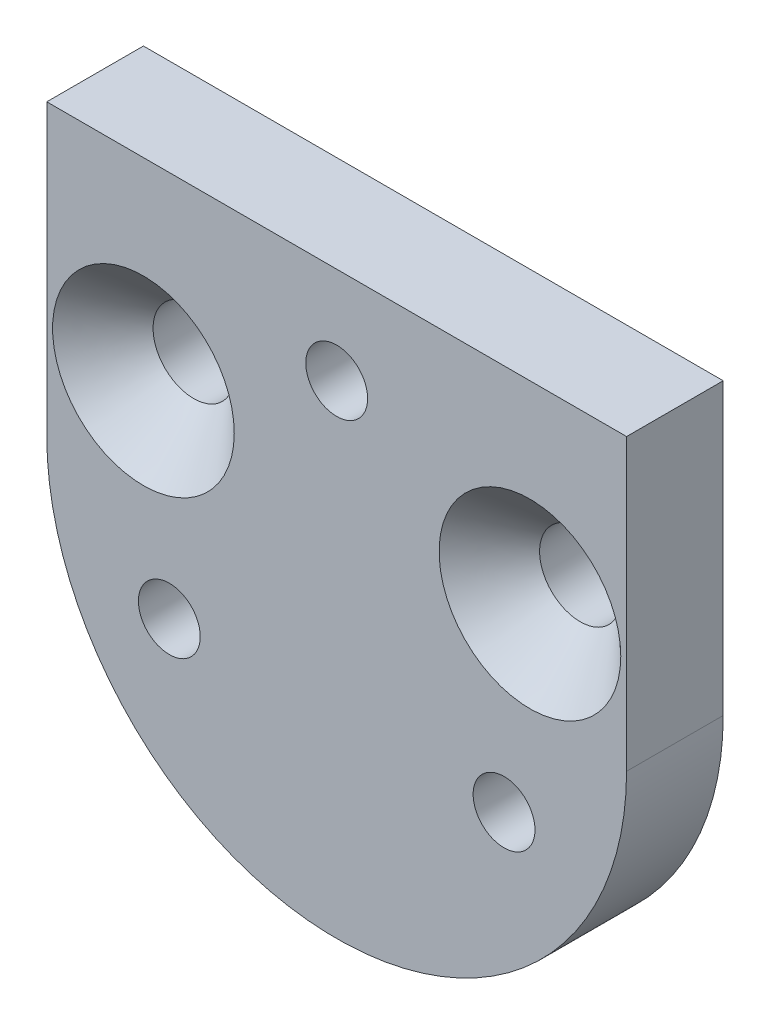
ISO-10303-21;
HEADER;
FILE_DESCRIPTION(('STEP AP214'),'2;1');
FILE_NAME('part.step','',(''),(''),'','','');
FILE_SCHEMA(('AUTOMOTIVE_DESIGN { 1 0 10303 214 1 1 1 1 }'));
ENDSEC;
DATA;
#1=APPLICATION_CONTEXT('core data for automotive mechanical design processes');
#2=APPLICATION_PROTOCOL_DEFINITION('international standard','automotive_design',2000,#1);
#3=PRODUCT_CONTEXT('',#1,'mechanical');
#4=PRODUCT('Part','Part','',(#3));
#5=PRODUCT_RELATED_PRODUCT_CATEGORY('part','',(#4));
#6=PRODUCT_DEFINITION_FORMATION('','',#4);
#7=PRODUCT_DEFINITION_CONTEXT('part definition',#1,'design');
#8=PRODUCT_DEFINITION('design','',#6,#7);
#9=PRODUCT_DEFINITION_SHAPE('','',#8);
#10=(LENGTH_UNIT() NAMED_UNIT(*) SI_UNIT(.MILLI.,.METRE.));
#11=(NAMED_UNIT(*) PLANE_ANGLE_UNIT() SI_UNIT($,.RADIAN.));
#12=(NAMED_UNIT(*) SI_UNIT($,.STERADIAN.) SOLID_ANGLE_UNIT());
#13=UNCERTAINTY_MEASURE_WITH_UNIT(LENGTH_MEASURE(1.E-05),#10,'distance_accuracy_value','');
#14=(GEOMETRIC_REPRESENTATION_CONTEXT(3) GLOBAL_UNCERTAINTY_ASSIGNED_CONTEXT((#13)) GLOBAL_UNIT_ASSIGNED_CONTEXT((#10,
#11,#12)) REPRESENTATION_CONTEXT('',''));
#15=CARTESIAN_POINT('',(0.,0.,0.));
#16=DIRECTION('',(0.,0.,1.));
#17=DIRECTION('',(1.,0.,0.));
#18=AXIS2_PLACEMENT_3D('',#15,#16,#17);
#19=CARTESIAN_POINT('',(-8.66025403784439,-5.,0.));
#20=DIRECTION('',(0.,0.,1.));
#21=DIRECTION('',(1.,0.,0.));
#22=AXIS2_PLACEMENT_3D('',#19,#20,#21);
#23=CYLINDRICAL_SURFACE('',#22,1.6);
#24=CARTESIAN_POINT('',(-8.66025403784439,-5.,5.));
#25=DIRECTION('',(0.,0.,1.));
#26=DIRECTION('',(1.,0.,0.));
#27=AXIS2_PLACEMENT_3D('',#24,#25,#26);
#28=CIRCLE('',#27,1.6);
#29=CARTESIAN_POINT('',(-7.06025403784438,-5.,5.));
#30=VERTEX_POINT('',#29);
#31=EDGE_CURVE('E356',#30,#30,#28,.T.);
#32=ORIENTED_EDGE('',*,*,#31,.T.);
#33=EDGE_LOOP('',(#32));
#34=FACE_BOUND('',#33,.T.);
#35=CARTESIAN_POINT('',(-8.66025403784439,-5.,2.6));
#36=DIRECTION('',(0.,0.,-1.));
#37=DIRECTION('',(-1.,0.,0.));
#38=AXIS2_PLACEMENT_3D('',#35,#36,#37);
#39=CIRCLE('',#38,1.6);
#40=CARTESIAN_POINT('',(-10.2602540378444,-5.,2.6));
#41=VERTEX_POINT('',#40);
#42=EDGE_CURVE('E38',#41,#41,#39,.F.);
#43=ORIENTED_EDGE('',*,*,#42,.F.);
#44=EDGE_LOOP('',(#43));
#45=FACE_BOUND('',#44,.T.);
#46=ADVANCED_FACE('F34',(#34,#45),#23,.F.);
#47=CARTESIAN_POINT('',(8.66025403784439,-5.,0.));
#48=DIRECTION('',(0.,0.,1.));
#49=DIRECTION('',(1.,0.,0.));
#50=AXIS2_PLACEMENT_3D('',#47,#48,#49);
#51=CYLINDRICAL_SURFACE('',#50,1.6);
#52=CARTESIAN_POINT('',(8.66025403784439,-5.,5.));
#53=DIRECTION('',(0.,0.,1.));
#54=DIRECTION('',(1.,0.,0.));
#55=AXIS2_PLACEMENT_3D('',#52,#53,#54);
#56=CIRCLE('',#55,1.6);
#57=CARTESIAN_POINT('',(10.2602540378444,-5.,5.));
#58=VERTEX_POINT('',#57);
#59=EDGE_CURVE('E353',#58,#58,#56,.T.);
#60=ORIENTED_EDGE('',*,*,#59,.T.);
#61=EDGE_LOOP('',(#60));
#62=FACE_BOUND('',#61,.T.);
#63=CARTESIAN_POINT('',(8.66025403784439,-5.,2.6));
#64=DIRECTION('',(0.,0.,-1.));
#65=DIRECTION('',(-1.,0.,0.));
#66=AXIS2_PLACEMENT_3D('',#63,#64,#65);
#67=CIRCLE('',#66,1.6);
#68=CARTESIAN_POINT('',(7.06025403784439,-5.,2.6));
#69=VERTEX_POINT('',#68);
#70=EDGE_CURVE('E389',#69,#69,#67,.F.);
#71=ORIENTED_EDGE('',*,*,#70,.F.);
#72=EDGE_LOOP('',(#71));
#73=FACE_BOUND('',#72,.T.);
#74=ADVANCED_FACE('F399',(#62,#73),#51,.F.);
#75=CARTESIAN_POINT('',(0.,10.,0.));
#76=DIRECTION('',(0.,0.,1.));
#77=DIRECTION('',(1.,0.,0.));
#78=AXIS2_PLACEMENT_3D('',#75,#76,#77);
#79=CYLINDRICAL_SURFACE('',#78,1.6);
#80=CARTESIAN_POINT('',(0.,10.,5.));
#81=DIRECTION('',(0.,0.,1.));
#82=DIRECTION('',(1.,0.,0.));
#83=AXIS2_PLACEMENT_3D('',#80,#81,#82);
#84=CIRCLE('',#83,1.6);
#85=CARTESIAN_POINT('',(1.6,10.,5.));
#86=VERTEX_POINT('',#85);
#87=EDGE_CURVE('E349',#86,#86,#84,.T.);
#88=ORIENTED_EDGE('',*,*,#87,.T.);
#89=EDGE_LOOP('',(#88));
#90=FACE_BOUND('',#89,.T.);
#91=CARTESIAN_POINT('',(0.,10.,2.6));
#92=DIRECTION('',(0.,0.,-1.));
#93=DIRECTION('',(-1.,0.,0.));
#94=AXIS2_PLACEMENT_3D('',#91,#92,#93);
#95=CIRCLE('',#94,1.6);
#96=CARTESIAN_POINT('',(-1.6,10.,2.6));
#97=VERTEX_POINT('',#96);
#98=EDGE_CURVE('E234',#97,#97,#95,.F.);
#99=ORIENTED_EDGE('',*,*,#98,.F.);
#100=EDGE_LOOP('',(#99));
#101=FACE_BOUND('',#100,.T.);
#102=ADVANCED_FACE('F405',(#90,#101),#79,.F.);
#103=CARTESIAN_POINT('',(-15.,15.,5.));
#104=DIRECTION('',(1.,0.,0.));
#105=DIRECTION('',(0.,1.,0.));
#106=AXIS2_PLACEMENT_3D('',#103,#104,#105);
#107=PLANE('',#106);
#108=DIRECTION('',(0.,-1.,0.));
#109=VECTOR('',#108,1.);
#110=CARTESIAN_POINT('',(-15.,15.,0.));
#111=LINE('',#110,#109);
#112=CARTESIAN_POINT('',(-15.,15.,0.));
#113=VERTEX_POINT('',#112);
#114=CARTESIAN_POINT('',(-15.,0.,0.));
#115=VERTEX_POINT('',#114);
#116=EDGE_CURVE('E352',#113,#115,#111,.T.);
#117=ORIENTED_EDGE('',*,*,#116,.T.);
#118=DIRECTION('',(0.,0.,-1.));
#119=VECTOR('',#118,1.);
#120=CARTESIAN_POINT('',(-15.,0.,5.));
#121=LINE('',#120,#119);
#122=CARTESIAN_POINT('',(-15.,0.,5.));
#123=VERTEX_POINT('',#122);
#124=EDGE_CURVE('E11',#123,#115,#121,.T.);
#125=ORIENTED_EDGE('',*,*,#124,.F.);
#126=DIRECTION('',(0.,-1.,0.));
#127=VECTOR('',#126,1.);
#128=CARTESIAN_POINT('',(-15.,15.,5.));
#129=LINE('',#128,#127);
#130=CARTESIAN_POINT('',(-15.,15.,5.));
#131=VERTEX_POINT('',#130);
#132=EDGE_CURVE('E359',#131,#123,#129,.T.);
#133=ORIENTED_EDGE('',*,*,#132,.F.);
#134=DIRECTION('',(0.,0.,-1.));
#135=VECTOR('',#134,1.);
#136=CARTESIAN_POINT('',(-15.,15.,5.));
#137=LINE('',#136,#135);
#138=EDGE_CURVE('E369',#131,#113,#137,.T.);
#139=ORIENTED_EDGE('',*,*,#138,.T.);
#140=EDGE_LOOP('',(#117,#125,#133,#139));
#141=FACE_BOUND('',#140,.T.);
#142=ADVANCED_FACE('F36',(#141),#107,.F.);
#143=CARTESIAN_POINT('',(0.,0.,5.));
#144=DIRECTION('',(0.,0.,-1.));
#145=DIRECTION('',(-1.,0.,0.));
#146=AXIS2_PLACEMENT_3D('',#143,#144,#145);
#147=CYLINDRICAL_SURFACE('',#146,15.);
#148=CARTESIAN_POINT('',(0.,0.,0.));
#149=DIRECTION('',(0.,0.,1.));
#150=DIRECTION('',(1.,0.,0.));
#151=AXIS2_PLACEMENT_3D('',#148,#149,#150);
#152=CIRCLE('',#151,15.);
#153=CARTESIAN_POINT('',(15.,0.,0.));
#154=VERTEX_POINT('',#153);
#155=EDGE_CURVE('E372',#115,#154,#152,.T.);
#156=ORIENTED_EDGE('',*,*,#155,.T.);
#157=DIRECTION('',(0.,0.,-1.));
#158=VECTOR('',#157,1.);
#159=CARTESIAN_POINT('',(15.,0.,5.));
#160=LINE('',#159,#158);
#161=CARTESIAN_POINT('',(15.,0.,5.));
#162=VERTEX_POINT('',#161);
#163=EDGE_CURVE('E43',#162,#154,#160,.T.);
#164=ORIENTED_EDGE('',*,*,#163,.F.);
#165=CARTESIAN_POINT('',(0.,0.,5.));
#166=DIRECTION('',(0.,0.,1.));
#167=DIRECTION('',(1.,0.,0.));
#168=AXIS2_PLACEMENT_3D('',#165,#166,#167);
#169=CIRCLE('',#168,15.);
#170=EDGE_CURVE('E362',#123,#162,#169,.T.);
#171=ORIENTED_EDGE('',*,*,#170,.F.);
#172=ORIENTED_EDGE('',*,*,#124,.T.);
#173=EDGE_LOOP('',(#156,#164,#171,#172));
#174=FACE_BOUND('',#173,.T.);
#175=ADVANCED_FACE('F425',(#174),#147,.T.);
#176=CARTESIAN_POINT('',(15.,15.,5.));
#177=DIRECTION('',(-1.,0.,0.));
#178=DIRECTION('',(0.,-1.,0.));
#179=AXIS2_PLACEMENT_3D('',#176,#177,#178);
#180=PLANE('',#179);
#181=DIRECTION('',(0.,1.,0.));
#182=VECTOR('',#181,1.);
#183=CARTESIAN_POINT('',(15.,15.,0.));
#184=LINE('',#183,#182);
#185=CARTESIAN_POINT('',(15.,15.,0.));
#186=VERTEX_POINT('',#185);
#187=EDGE_CURVE('E374',#154,#186,#184,.T.);
#188=ORIENTED_EDGE('',*,*,#187,.T.);
#189=DIRECTION('',(0.,0.,-1.));
#190=VECTOR('',#189,1.);
#191=CARTESIAN_POINT('',(15.,15.,5.));
#192=LINE('',#191,#190);
#193=CARTESIAN_POINT('',(15.,15.,5.));
#194=VERTEX_POINT('',#193);
#195=EDGE_CURVE('E379',#194,#186,#192,.T.);
#196=ORIENTED_EDGE('',*,*,#195,.F.);
#197=DIRECTION('',(0.,1.,0.));
#198=VECTOR('',#197,1.);
#199=CARTESIAN_POINT('',(15.,15.,5.));
#200=LINE('',#199,#198);
#201=EDGE_CURVE('E365',#162,#194,#200,.T.);
#202=ORIENTED_EDGE('',*,*,#201,.F.);
#203=ORIENTED_EDGE('',*,*,#163,.T.);
#204=EDGE_LOOP('',(#188,#196,#202,#203));
#205=FACE_BOUND('',#204,.T.);
#206=ADVANCED_FACE('F422',(#205),#180,.F.);
#207=CARTESIAN_POINT('',(-15.,15.,5.));
#208=DIRECTION('',(0.,-1.,0.));
#209=DIRECTION('',(0.,0.,-1.));
#210=AXIS2_PLACEMENT_3D('',#207,#208,#209);
#211=PLANE('',#210);
#212=DIRECTION('',(-1.,0.,0.));
#213=VECTOR('',#212,1.);
#214=CARTESIAN_POINT('',(-15.,15.,0.));
#215=LINE('',#214,#213);
#216=EDGE_CURVE('E363',#186,#113,#215,.T.);
#217=ORIENTED_EDGE('',*,*,#216,.T.);
#218=ORIENTED_EDGE('',*,*,#138,.F.);
#219=DIRECTION('',(-1.,0.,0.));
#220=VECTOR('',#219,1.);
#221=CARTESIAN_POINT('',(-15.,15.,5.));
#222=LINE('',#221,#220);
#223=EDGE_CURVE('E367',#194,#131,#222,.T.);
#224=ORIENTED_EDGE('',*,*,#223,.F.);
#225=ORIENTED_EDGE('',*,*,#195,.T.);
#226=EDGE_LOOP('',(#217,#218,#224,#225));
#227=FACE_BOUND('',#226,.T.);
#228=ADVANCED_FACE('F414',(#227),#211,.F.);
#229=CARTESIAN_POINT('',(0.,0.,5.));
#230=DIRECTION('',(0.,0.,1.));
#231=DIRECTION('',(1.,0.,0.));
#232=AXIS2_PLACEMENT_3D('',#229,#230,#231);
#233=PLANE('',#232);
#234=CARTESIAN_POINT('',(-10.,5.,5.));
#235=DIRECTION('',(0.,0.,1.));
#236=DIRECTION('',(1.,0.,0.));
#237=AXIS2_PLACEMENT_3D('',#234,#235,#236);
#238=CIRCLE('',#237,4.7);
#239=CARTESIAN_POINT('',(-5.3,5.,5.));
#240=VERTEX_POINT('',#239);
#241=EDGE_CURVE('E335',#240,#240,#238,.T.);
#242=ORIENTED_EDGE('',*,*,#241,.F.);
#243=EDGE_LOOP('',(#242));
#244=FACE_BOUND('',#243,.T.);
#245=CARTESIAN_POINT('',(10.,5.,5.));
#246=DIRECTION('',(0.,0.,1.));
#247=DIRECTION('',(1.,0.,0.));
#248=AXIS2_PLACEMENT_3D('',#245,#246,#247);
#249=CIRCLE('',#248,4.7);
#250=CARTESIAN_POINT('',(14.7,5.,5.));
#251=VERTEX_POINT('',#250);
#252=EDGE_CURVE('E342',#251,#251,#249,.T.);
#253=ORIENTED_EDGE('',*,*,#252,.F.);
#254=EDGE_LOOP('',(#253));
#255=FACE_BOUND('',#254,.T.);
#256=ORIENTED_EDGE('',*,*,#87,.F.);
#257=EDGE_LOOP('',(#256));
#258=FACE_BOUND('',#257,.T.);
#259=ORIENTED_EDGE('',*,*,#59,.F.);
#260=EDGE_LOOP('',(#259));
#261=FACE_BOUND('',#260,.T.);
#262=ORIENTED_EDGE('',*,*,#31,.F.);
#263=EDGE_LOOP('',(#262));
#264=FACE_BOUND('',#263,.T.);
#265=ORIENTED_EDGE('',*,*,#132,.T.);
#266=ORIENTED_EDGE('',*,*,#170,.T.);
#267=ORIENTED_EDGE('',*,*,#201,.T.);
#268=ORIENTED_EDGE('',*,*,#223,.T.);
#269=EDGE_LOOP('',(#265,#266,#267,#268));
#270=FACE_BOUND('',#269,.T.);
#271=ADVANCED_FACE('F410',(#244,#255,#258,#261,#264,#270),#233,.T.);
#272=CARTESIAN_POINT('',(0.,0.,0.));
#273=DIRECTION('',(0.,0.,1.));
#274=DIRECTION('',(1.,0.,0.));
#275=AXIS2_PLACEMENT_3D('',#272,#273,#274);
#276=PLANE('',#275);
#277=DIRECTION('',(0.5,0.866025403784438,0.));
#278=VECTOR('',#277,1.);
#279=CARTESIAN_POINT('',(-3.2331615074619,10.,0.));
#280=LINE('',#279,#278);
#281=CARTESIAN_POINT('',(-3.2331615074619,10.,0.));
#282=VERTEX_POINT('',#281);
#283=CARTESIAN_POINT('',(-1.61658075373095,12.8,0.));
#284=VERTEX_POINT('',#283);
#285=EDGE_CURVE('E221',#282,#284,#280,.T.);
#286=ORIENTED_EDGE('',*,*,#285,.F.);
#287=DIRECTION('',(-0.5,0.866025403784439,0.));
#288=VECTOR('',#287,1.);
#289=CARTESIAN_POINT('',(-1.61658075373095,7.2,0.));
#290=LINE('',#289,#288);
#291=CARTESIAN_POINT('',(-1.61658075373095,7.2,0.));
#292=VERTEX_POINT('',#291);
#293=EDGE_CURVE('E51',#292,#282,#290,.T.);
#294=ORIENTED_EDGE('',*,*,#293,.F.);
#295=DIRECTION('',(-1.,0.,0.));
#296=VECTOR('',#295,1.);
#297=CARTESIAN_POINT('',(1.61658075373095,7.2,0.));
#298=LINE('',#297,#296);
#299=CARTESIAN_POINT('',(1.61658075373095,7.2,0.));
#300=VERTEX_POINT('',#299);
#301=EDGE_CURVE('E207',#300,#292,#298,.T.);
#302=ORIENTED_EDGE('',*,*,#301,.F.);
#303=DIRECTION('',(-0.5,-0.866025403784439,0.));
#304=VECTOR('',#303,1.);
#305=CARTESIAN_POINT('',(3.2331615074619,10.,0.));
#306=LINE('',#305,#304);
#307=CARTESIAN_POINT('',(3.2331615074619,10.,0.));
#308=VERTEX_POINT('',#307);
#309=EDGE_CURVE('E210',#308,#300,#306,.T.);
#310=ORIENTED_EDGE('',*,*,#309,.F.);
#311=DIRECTION('',(0.5,-0.866025403784439,0.));
#312=VECTOR('',#311,1.);
#313=CARTESIAN_POINT('',(1.61658075373095,12.8,0.));
#314=LINE('',#313,#312);
#315=CARTESIAN_POINT('',(1.61658075373095,12.8,0.));
#316=VERTEX_POINT('',#315);
#317=EDGE_CURVE('E227',#316,#308,#314,.T.);
#318=ORIENTED_EDGE('',*,*,#317,.F.);
#319=DIRECTION('',(1.,0.,0.));
#320=VECTOR('',#319,1.);
#321=CARTESIAN_POINT('',(-1.61658075373095,12.8,0.));
#322=LINE('',#321,#320);
#323=EDGE_CURVE('E224',#284,#316,#322,.T.);
#324=ORIENTED_EDGE('',*,*,#323,.F.);
#325=EDGE_LOOP('',(#286,#294,#302,#310,#318,#324));
#326=FACE_BOUND('',#325,.T.);
#327=DIRECTION('',(0.5,0.866025403784438,0.));
#328=VECTOR('',#327,1.);
#329=CARTESIAN_POINT('',(-11.8934155453063,-5.,0.));
#330=LINE('',#329,#328);
#331=CARTESIAN_POINT('',(-11.8934155453063,-5.,0.));
#332=VERTEX_POINT('',#331);
#333=CARTESIAN_POINT('',(-10.2768347915753,-2.20000000000001,0.));
#334=VERTEX_POINT('',#333);
#335=EDGE_CURVE('E263',#332,#334,#330,.T.);
#336=ORIENTED_EDGE('',*,*,#335,.F.);
#337=DIRECTION('',(-0.5,0.866025403784439,0.));
#338=VECTOR('',#337,1.);
#339=CARTESIAN_POINT('',(-10.2768347915753,-7.8,0.));
#340=LINE('',#339,#338);
#341=CARTESIAN_POINT('',(-10.2768347915753,-7.8,0.));
#342=VERTEX_POINT('',#341);
#343=EDGE_CURVE('E59',#342,#332,#340,.T.);
#344=ORIENTED_EDGE('',*,*,#343,.F.);
#345=DIRECTION('',(-1.,0.,0.));
#346=VECTOR('',#345,1.);
#347=CARTESIAN_POINT('',(-7.04367328411343,-7.8,0.));
#348=LINE('',#347,#346);
#349=CARTESIAN_POINT('',(-7.04367328411343,-7.8,0.));
#350=VERTEX_POINT('',#349);
#351=EDGE_CURVE('E246',#350,#342,#348,.T.);
#352=ORIENTED_EDGE('',*,*,#351,.F.);
#353=DIRECTION('',(-0.5,-0.866025403784439,0.));
#354=VECTOR('',#353,1.);
#355=CARTESIAN_POINT('',(-5.42709253038248,-5.00000000000001,0.));
#356=LINE('',#355,#354);
#357=CARTESIAN_POINT('',(-5.42709253038248,-5.00000000000001,0.));
#358=VERTEX_POINT('',#357);
#359=EDGE_CURVE('E273',#358,#350,#356,.T.);
#360=ORIENTED_EDGE('',*,*,#359,.F.);
#361=DIRECTION('',(0.5,-0.866025403784439,0.));
#362=VECTOR('',#361,1.);
#363=CARTESIAN_POINT('',(-7.04367328411343,-2.20000000000001,0.));
#364=LINE('',#363,#362);
#365=CARTESIAN_POINT('',(-7.04367328411343,-2.20000000000001,0.));
#366=VERTEX_POINT('',#365);
#367=EDGE_CURVE('E270',#366,#358,#364,.T.);
#368=ORIENTED_EDGE('',*,*,#367,.F.);
#369=DIRECTION('',(1.,0.,0.));
#370=VECTOR('',#369,1.);
#371=CARTESIAN_POINT('',(-10.2768347915753,-2.20000000000001,0.));
#372=LINE('',#371,#370);
#373=EDGE_CURVE('E267',#334,#366,#372,.T.);
#374=ORIENTED_EDGE('',*,*,#373,.F.);
#375=EDGE_LOOP('',(#336,#344,#352,#360,#368,#374));
#376=FACE_BOUND('',#375,.T.);
#377=DIRECTION('',(0.5,0.866025403784439,0.));
#378=VECTOR('',#377,1.);
#379=CARTESIAN_POINT('',(5.42709253038249,-5.,0.));
#380=LINE('',#379,#378);
#381=CARTESIAN_POINT('',(5.42709253038249,-5.,0.));
#382=VERTEX_POINT('',#381);
#383=CARTESIAN_POINT('',(7.04367328411344,-2.2,0.));
#384=VERTEX_POINT('',#383);
#385=EDGE_CURVE('E310',#382,#384,#380,.T.);
#386=ORIENTED_EDGE('',*,*,#385,.F.);
#387=DIRECTION('',(-0.5,0.866025403784439,0.));
#388=VECTOR('',#387,1.);
#389=CARTESIAN_POINT('',(7.04367328411344,-7.8,0.));
#390=LINE('',#389,#388);
#391=CARTESIAN_POINT('',(7.04367328411344,-7.8,0.));
#392=VERTEX_POINT('',#391);
#393=EDGE_CURVE('E308',#392,#382,#390,.T.);
#394=ORIENTED_EDGE('',*,*,#393,.F.);
#395=DIRECTION('',(-1.,0.,0.));
#396=VECTOR('',#395,1.);
#397=CARTESIAN_POINT('',(10.2768347915753,-7.8,0.));
#398=LINE('',#397,#396);
#399=CARTESIAN_POINT('',(10.2768347915753,-7.8,0.));
#400=VERTEX_POINT('',#399);
#401=EDGE_CURVE('E292',#400,#392,#398,.T.);
#402=ORIENTED_EDGE('',*,*,#401,.F.);
#403=DIRECTION('',(-0.5,-0.866025403784439,0.));
#404=VECTOR('',#403,1.);
#405=CARTESIAN_POINT('',(11.8934155453063,-5.,0.));
#406=LINE('',#405,#404);
#407=CARTESIAN_POINT('',(11.8934155453063,-5.,0.));
#408=VERTEX_POINT('',#407);
#409=EDGE_CURVE('E319',#408,#400,#406,.T.);
#410=ORIENTED_EDGE('',*,*,#409,.F.);
#411=DIRECTION('',(0.5,-0.866025403784439,0.));
#412=VECTOR('',#411,1.);
#413=CARTESIAN_POINT('',(10.2768347915753,-2.2,0.));
#414=LINE('',#413,#412);
#415=CARTESIAN_POINT('',(10.2768347915753,-2.2,0.));
#416=VERTEX_POINT('',#415);
#417=EDGE_CURVE('E316',#416,#408,#414,.T.);
#418=ORIENTED_EDGE('',*,*,#417,.F.);
#419=DIRECTION('',(1.,0.,0.));
#420=VECTOR('',#419,1.);
#421=CARTESIAN_POINT('',(7.04367328411344,-2.2,0.));
#422=LINE('',#421,#420);
#423=EDGE_CURVE('E313',#384,#416,#422,.T.);
#424=ORIENTED_EDGE('',*,*,#423,.F.);
#425=EDGE_LOOP('',(#386,#394,#402,#410,#418,#424));
#426=FACE_BOUND('',#425,.T.);
#427=CARTESIAN_POINT('',(-10.,5.,0.));
#428=DIRECTION('',(0.,0.,1.));
#429=DIRECTION('',(1.,0.,0.));
#430=AXIS2_PLACEMENT_3D('',#427,#428,#429);
#431=CIRCLE('',#430,2.1);
#432=CARTESIAN_POINT('',(-7.9,5.,0.));
#433=VERTEX_POINT('',#432);
#434=EDGE_CURVE('E341',#433,#433,#431,.T.);
#435=ORIENTED_EDGE('',*,*,#434,.T.);
#436=EDGE_LOOP('',(#435));
#437=FACE_BOUND('',#436,.T.);
#438=CARTESIAN_POINT('',(10.,5.,0.));
#439=DIRECTION('',(0.,0.,1.));
#440=DIRECTION('',(1.,0.,0.));
#441=AXIS2_PLACEMENT_3D('',#438,#439,#440);
#442=CIRCLE('',#441,2.1);
#443=CARTESIAN_POINT('',(12.1,5.,0.));
#444=VERTEX_POINT('',#443);
#445=EDGE_CURVE('E348',#444,#444,#442,.T.);
#446=ORIENTED_EDGE('',*,*,#445,.T.);
#447=EDGE_LOOP('',(#446));
#448=FACE_BOUND('',#447,.T.);
#449=ORIENTED_EDGE('',*,*,#116,.F.);
#450=ORIENTED_EDGE('',*,*,#216,.F.);
#451=ORIENTED_EDGE('',*,*,#187,.F.);
#452=ORIENTED_EDGE('',*,*,#155,.F.);
#453=EDGE_LOOP('',(#449,#450,#451,#452));
#454=FACE_BOUND('',#453,.T.);
#455=ADVANCED_FACE('F413',(#326,#376,#426,#437,#448,#454),#276,.F.);
#456=CARTESIAN_POINT('',(10.,5.,5.));
#457=DIRECTION('',(0.,0.,1.));
#458=DIRECTION('',(1.,0.,0.));
#459=AXIS2_PLACEMENT_3D('',#456,#457,#458);
#460=CYLINDRICAL_SURFACE('',#459,2.1);
#461=CARTESIAN_POINT('',(10.,5.,2.4));
#462=DIRECTION('',(0.,0.,1.));
#463=DIRECTION('',(1.,0.,0.));
#464=AXIS2_PLACEMENT_3D('',#461,#462,#463);
#465=CIRCLE('',#464,2.1);
#466=CARTESIAN_POINT('',(12.1,5.,2.4));
#467=VERTEX_POINT('',#466);
#468=EDGE_CURVE('E345',#467,#467,#465,.T.);
#469=ORIENTED_EDGE('',*,*,#468,.T.);
#470=EDGE_LOOP('',(#469));
#471=FACE_BOUND('',#470,.T.);
#472=ORIENTED_EDGE('',*,*,#445,.F.);
#473=EDGE_LOOP('',(#472));
#474=FACE_BOUND('',#473,.T.);
#475=ADVANCED_FACE('F418',(#471,#474),#460,.F.);
#476=CARTESIAN_POINT('',(10.,5.,5.));
#477=DIRECTION('',(0.,0.,1.));
#478=DIRECTION('',(1.,0.,0.));
#479=AXIS2_PLACEMENT_3D('',#476,#477,#478);
#480=CONICAL_SURFACE('',#479,4.7,0.785398163397449);
#481=ORIENTED_EDGE('',*,*,#468,.F.);
#482=EDGE_LOOP('',(#481));
#483=FACE_BOUND('',#482,.T.);
#484=ORIENTED_EDGE('',*,*,#252,.T.);
#485=EDGE_LOOP('',(#484));
#486=FACE_BOUND('',#485,.T.);
#487=ADVANCED_FACE('F455',(#483,#486),#480,.F.);
#488=CARTESIAN_POINT('',(-10.,5.,5.));
#489=DIRECTION('',(0.,0.,1.));
#490=DIRECTION('',(1.,0.,0.));
#491=AXIS2_PLACEMENT_3D('',#488,#489,#490);
#492=CYLINDRICAL_SURFACE('',#491,2.1);
#493=CARTESIAN_POINT('',(-10.,5.,2.4));
#494=DIRECTION('',(0.,0.,1.));
#495=DIRECTION('',(1.,0.,0.));
#496=AXIS2_PLACEMENT_3D('',#493,#494,#495);
#497=CIRCLE('',#496,2.1);
#498=CARTESIAN_POINT('',(-7.9,5.,2.4));
#499=VERTEX_POINT('',#498);
#500=EDGE_CURVE('E338',#499,#499,#497,.T.);
#501=ORIENTED_EDGE('',*,*,#500,.T.);
#502=EDGE_LOOP('',(#501));
#503=FACE_BOUND('',#502,.T.);
#504=ORIENTED_EDGE('',*,*,#434,.F.);
#505=EDGE_LOOP('',(#504));
#506=FACE_BOUND('',#505,.T.);
#507=ADVANCED_FACE('F459',(#503,#506),#492,.F.);
#508=CARTESIAN_POINT('',(-10.,5.,5.));
#509=DIRECTION('',(0.,0.,1.));
#510=DIRECTION('',(1.,0.,0.));
#511=AXIS2_PLACEMENT_3D('',#508,#509,#510);
#512=CONICAL_SURFACE('',#511,4.7,0.785398163397449);
#513=ORIENTED_EDGE('',*,*,#500,.F.);
#514=EDGE_LOOP('',(#513));
#515=FACE_BOUND('',#514,.T.);
#516=ORIENTED_EDGE('',*,*,#241,.T.);
#517=EDGE_LOOP('',(#516));
#518=FACE_BOUND('',#517,.T.);
#519=ADVANCED_FACE('F463',(#515,#518),#512,.F.);
#520=CARTESIAN_POINT('',(0.,0.,2.6));
#521=DIRECTION('',(0.,0.,-1.));
#522=DIRECTION('',(-1.,0.,0.));
#523=AXIS2_PLACEMENT_3D('',#520,#521,#522);
#524=PLANE('',#523);
#525=DIRECTION('',(-0.5,0.866025403784439,0.));
#526=VECTOR('',#525,1.);
#527=CARTESIAN_POINT('',(-1.61658075373095,7.2,2.6));
#528=LINE('',#527,#526);
#529=CARTESIAN_POINT('',(-1.61658075373095,7.2,2.6));
#530=VERTEX_POINT('',#529);
#531=CARTESIAN_POINT('',(-3.2331615074619,10.,2.6));
#532=VERTEX_POINT('',#531);
#533=EDGE_CURVE('E187',#530,#532,#528,.T.);
#534=ORIENTED_EDGE('',*,*,#533,.T.);
#535=DIRECTION('',(0.5,0.866025403784438,0.));
#536=VECTOR('',#535,1.);
#537=CARTESIAN_POINT('',(-3.2331615074619,10.,2.6));
#538=LINE('',#537,#536);
#539=CARTESIAN_POINT('',(-1.61658075373095,12.8,2.6));
#540=VERTEX_POINT('',#539);
#541=EDGE_CURVE('E196',#532,#540,#538,.T.);
#542=ORIENTED_EDGE('',*,*,#541,.T.);
#543=DIRECTION('',(1.,0.,0.));
#544=VECTOR('',#543,1.);
#545=CARTESIAN_POINT('',(-1.61658075373095,12.8,2.6));
#546=LINE('',#545,#544);
#547=CARTESIAN_POINT('',(1.61658075373095,12.8,2.6));
#548=VERTEX_POINT('',#547);
#549=EDGE_CURVE('E201',#540,#548,#546,.T.);
#550=ORIENTED_EDGE('',*,*,#549,.T.);
#551=DIRECTION('',(0.5,-0.866025403784439,0.));
#552=VECTOR('',#551,1.);
#553=CARTESIAN_POINT('',(1.61658075373095,12.8,2.6));
#554=LINE('',#553,#552);
#555=CARTESIAN_POINT('',(3.2331615074619,10.,2.6));
#556=VERTEX_POINT('',#555);
#557=EDGE_CURVE('E214',#548,#556,#554,.T.);
#558=ORIENTED_EDGE('',*,*,#557,.T.);
#559=DIRECTION('',(-0.5,-0.866025403784439,0.));
#560=VECTOR('',#559,1.);
#561=CARTESIAN_POINT('',(3.2331615074619,10.,2.6));
#562=LINE('',#561,#560);
#563=CARTESIAN_POINT('',(1.61658075373095,7.2,2.6));
#564=VERTEX_POINT('',#563);
#565=EDGE_CURVE('E217',#556,#564,#562,.T.);
#566=ORIENTED_EDGE('',*,*,#565,.T.);
#567=DIRECTION('',(-1.,0.,0.));
#568=VECTOR('',#567,1.);
#569=CARTESIAN_POINT('',(1.61658075373095,7.2,2.6));
#570=LINE('',#569,#568);
#571=EDGE_CURVE('E193',#564,#530,#570,.T.);
#572=ORIENTED_EDGE('',*,*,#571,.T.);
#573=EDGE_LOOP('',(#534,#542,#550,#558,#566,#572));
#574=FACE_BOUND('',#573,.T.);
#575=ORIENTED_EDGE('',*,*,#98,.T.);
#576=EDGE_LOOP('',(#575));
#577=FACE_BOUND('',#576,.T.);
#578=ADVANCED_FACE('F203',(#574,#577),#524,.T.);
#579=CARTESIAN_POINT('',(-1.61658075373095,7.2,2.6));
#580=DIRECTION('',(-0.866025403784439,-0.5,0.));
#581=DIRECTION('',(0.5,-0.866025403784439,0.));
#582=AXIS2_PLACEMENT_3D('',#579,#580,#581);
#583=PLANE('',#582);
#584=ORIENTED_EDGE('',*,*,#293,.T.);
#585=DIRECTION('',(0.,0.,-1.));
#586=VECTOR('',#585,1.);
#587=CARTESIAN_POINT('',(-3.2331615074619,10.,2.6));
#588=LINE('',#587,#586);
#589=EDGE_CURVE('E183',#532,#282,#588,.T.);
#590=ORIENTED_EDGE('',*,*,#589,.F.);
#591=ORIENTED_EDGE('',*,*,#533,.F.);
#592=DIRECTION('',(0.,0.,-1.));
#593=VECTOR('',#592,1.);
#594=CARTESIAN_POINT('',(-1.61658075373095,7.2,2.6));
#595=LINE('',#594,#593);
#596=EDGE_CURVE('E232',#530,#292,#595,.T.);
#597=ORIENTED_EDGE('',*,*,#596,.T.);
#598=EDGE_LOOP('',(#584,#590,#591,#597));
#599=FACE_BOUND('',#598,.T.);
#600=ADVANCED_FACE('F185',(#599),#583,.F.);
#601=CARTESIAN_POINT('',(1.61658075373095,7.2,2.6));
#602=DIRECTION('',(0.,-1.,0.));
#603=DIRECTION('',(1.,0.,0.));
#604=AXIS2_PLACEMENT_3D('',#601,#602,#603);
#605=PLANE('',#604);
#606=ORIENTED_EDGE('',*,*,#301,.T.);
#607=ORIENTED_EDGE('',*,*,#596,.F.);
#608=ORIENTED_EDGE('',*,*,#571,.F.);
#609=DIRECTION('',(0.,0.,-1.));
#610=VECTOR('',#609,1.);
#611=CARTESIAN_POINT('',(1.61658075373095,7.2,2.6));
#612=LINE('',#611,#610);
#613=EDGE_CURVE('E235',#564,#300,#612,.T.);
#614=ORIENTED_EDGE('',*,*,#613,.T.);
#615=EDGE_LOOP('',(#606,#607,#608,#614));
#616=FACE_BOUND('',#615,.T.);
#617=ADVANCED_FACE('F524',(#616),#605,.F.);
#618=CARTESIAN_POINT('',(3.2331615074619,10.,2.6));
#619=DIRECTION('',(0.866025403784439,-0.5,0.));
#620=DIRECTION('',(0.5,0.866025403784439,0.));
#621=AXIS2_PLACEMENT_3D('',#618,#619,#620);
#622=PLANE('',#621);
#623=ORIENTED_EDGE('',*,*,#309,.T.);
#624=ORIENTED_EDGE('',*,*,#613,.F.);
#625=ORIENTED_EDGE('',*,*,#565,.F.);
#626=DIRECTION('',(0.,0.,-1.));
#627=VECTOR('',#626,1.);
#628=CARTESIAN_POINT('',(3.2331615074619,10.,2.6));
#629=LINE('',#628,#627);
#630=EDGE_CURVE('E237',#556,#308,#629,.T.);
#631=ORIENTED_EDGE('',*,*,#630,.T.);
#632=EDGE_LOOP('',(#623,#624,#625,#631));
#633=FACE_BOUND('',#632,.T.);
#634=ADVANCED_FACE('F534',(#633),#622,.F.);
#635=CARTESIAN_POINT('',(1.61658075373095,12.8,2.6));
#636=DIRECTION('',(0.866025403784439,0.5,0.));
#637=DIRECTION('',(-0.5,0.866025403784439,0.));
#638=AXIS2_PLACEMENT_3D('',#635,#636,#637);
#639=PLANE('',#638);
#640=ORIENTED_EDGE('',*,*,#317,.T.);
#641=ORIENTED_EDGE('',*,*,#630,.F.);
#642=ORIENTED_EDGE('',*,*,#557,.F.);
#643=DIRECTION('',(0.,0.,-1.));
#644=VECTOR('',#643,1.);
#645=CARTESIAN_POINT('',(1.61658075373095,12.8,2.6));
#646=LINE('',#645,#644);
#647=EDGE_CURVE('E239',#548,#316,#646,.T.);
#648=ORIENTED_EDGE('',*,*,#647,.T.);
#649=EDGE_LOOP('',(#640,#641,#642,#648));
#650=FACE_BOUND('',#649,.T.);
#651=ADVANCED_FACE('F530',(#650),#639,.F.);
#652=CARTESIAN_POINT('',(-1.61658075373095,12.8,2.6));
#653=DIRECTION('',(0.,1.,0.));
#654=DIRECTION('',(0.,0.,1.));
#655=AXIS2_PLACEMENT_3D('',#652,#653,#654);
#656=PLANE('',#655);
#657=ORIENTED_EDGE('',*,*,#323,.T.);
#658=ORIENTED_EDGE('',*,*,#647,.F.);
#659=ORIENTED_EDGE('',*,*,#549,.F.);
#660=DIRECTION('',(0.,0.,-1.));
#661=VECTOR('',#660,1.);
#662=CARTESIAN_POINT('',(-1.61658075373095,12.8,2.6));
#663=LINE('',#662,#661);
#664=EDGE_CURVE('E192',#540,#284,#663,.T.);
#665=ORIENTED_EDGE('',*,*,#664,.T.);
#666=EDGE_LOOP('',(#657,#658,#659,#665));
#667=FACE_BOUND('',#666,.T.);
#668=ADVANCED_FACE('F527',(#667),#656,.F.);
#669=CARTESIAN_POINT('',(-3.2331615074619,10.,2.6));
#670=DIRECTION('',(-0.866025403784439,0.5,0.));
#671=DIRECTION('',(-0.5,-0.866025403784439,0.));
#672=AXIS2_PLACEMENT_3D('',#669,#670,#671);
#673=PLANE('',#672);
#674=ORIENTED_EDGE('',*,*,#285,.T.);
#675=ORIENTED_EDGE('',*,*,#664,.F.);
#676=ORIENTED_EDGE('',*,*,#541,.F.);
#677=ORIENTED_EDGE('',*,*,#589,.T.);
#678=EDGE_LOOP('',(#674,#675,#676,#677));
#679=FACE_BOUND('',#678,.T.);
#680=ADVANCED_FACE('F197',(#679),#673,.F.);
#681=CARTESIAN_POINT('',(0.,0.,2.6));
#682=DIRECTION('',(0.,0.,-1.));
#683=DIRECTION('',(-1.,0.,0.));
#684=AXIS2_PLACEMENT_3D('',#681,#682,#683);
#685=PLANE('',#684);
#686=DIRECTION('',(-0.5,0.866025403784439,0.));
#687=VECTOR('',#686,1.);
#688=CARTESIAN_POINT('',(7.04367328411344,-7.8,2.6));
#689=LINE('',#688,#687);
#690=CARTESIAN_POINT('',(7.04367328411344,-7.8,2.6));
#691=VERTEX_POINT('',#690);
#692=CARTESIAN_POINT('',(5.42709253038249,-5.,2.6));
#693=VERTEX_POINT('',#692);
#694=EDGE_CURVE('E288',#691,#693,#689,.T.);
#695=ORIENTED_EDGE('',*,*,#694,.T.);
#696=DIRECTION('',(0.5,0.866025403784439,0.));
#697=VECTOR('',#696,1.);
#698=CARTESIAN_POINT('',(5.42709253038249,-5.,2.6));
#699=LINE('',#698,#697);
#700=CARTESIAN_POINT('',(7.04367328411344,-2.2,2.6));
#701=VERTEX_POINT('',#700);
#702=EDGE_CURVE('E291',#693,#701,#699,.T.);
#703=ORIENTED_EDGE('',*,*,#702,.T.);
#704=DIRECTION('',(1.,0.,0.));
#705=VECTOR('',#704,1.);
#706=CARTESIAN_POINT('',(7.04367328411344,-2.2,2.6));
#707=LINE('',#706,#705);
#708=CARTESIAN_POINT('',(10.2768347915753,-2.2,2.6));
#709=VERTEX_POINT('',#708);
#710=EDGE_CURVE('E295',#701,#709,#707,.T.);
#711=ORIENTED_EDGE('',*,*,#710,.T.);
#712=DIRECTION('',(0.5,-0.866025403784439,0.));
#713=VECTOR('',#712,1.);
#714=CARTESIAN_POINT('',(10.2768347915753,-2.2,2.6));
#715=LINE('',#714,#713);
#716=CARTESIAN_POINT('',(11.8934155453063,-5.,2.6));
#717=VERTEX_POINT('',#716);
#718=EDGE_CURVE('E298',#709,#717,#715,.T.);
#719=ORIENTED_EDGE('',*,*,#718,.T.);
#720=DIRECTION('',(-0.5,-0.866025403784439,0.));
#721=VECTOR('',#720,1.);
#722=CARTESIAN_POINT('',(11.8934155453063,-5.,2.6));
#723=LINE('',#722,#721);
#724=CARTESIAN_POINT('',(10.2768347915753,-7.8,2.6));
#725=VERTEX_POINT('',#724);
#726=EDGE_CURVE('E301',#717,#725,#723,.T.);
#727=ORIENTED_EDGE('',*,*,#726,.T.);
#728=DIRECTION('',(-1.,0.,0.));
#729=VECTOR('',#728,1.);
#730=CARTESIAN_POINT('',(10.2768347915753,-7.8,2.6));
#731=LINE('',#730,#729);
#732=EDGE_CURVE('E304',#725,#691,#731,.T.);
#733=ORIENTED_EDGE('',*,*,#732,.T.);
#734=EDGE_LOOP('',(#695,#703,#711,#719,#727,#733));
#735=FACE_BOUND('',#734,.T.);
#736=ORIENTED_EDGE('',*,*,#70,.T.);
#737=EDGE_LOOP('',(#736));
#738=FACE_BOUND('',#737,.T.);
#739=ADVANCED_FACE('F472',(#735,#738),#685,.T.);
#740=CARTESIAN_POINT('',(7.04367328411344,-7.8,2.6));
#741=DIRECTION('',(-0.866025403784439,-0.5,0.));
#742=DIRECTION('',(0.5,-0.866025403784439,0.));
#743=AXIS2_PLACEMENT_3D('',#740,#741,#742);
#744=PLANE('',#743);
#745=ORIENTED_EDGE('',*,*,#393,.T.);
#746=DIRECTION('',(0.,0.,-1.));
#747=VECTOR('',#746,1.);
#748=CARTESIAN_POINT('',(5.42709253038249,-5.,2.6));
#749=LINE('',#748,#747);
#750=EDGE_CURVE('E307',#693,#382,#749,.T.);
#751=ORIENTED_EDGE('',*,*,#750,.F.);
#752=ORIENTED_EDGE('',*,*,#694,.F.);
#753=DIRECTION('',(0.,0.,-1.));
#754=VECTOR('',#753,1.);
#755=CARTESIAN_POINT('',(7.04367328411344,-7.8,2.6));
#756=LINE('',#755,#754);
#757=EDGE_CURVE('E264',#691,#392,#756,.T.);
#758=ORIENTED_EDGE('',*,*,#757,.T.);
#759=EDGE_LOOP('',(#745,#751,#752,#758));
#760=FACE_BOUND('',#759,.T.);
#761=ADVANCED_FACE('F468',(#760),#744,.F.);
#762=CARTESIAN_POINT('',(10.2768347915753,-7.8,2.6));
#763=DIRECTION('',(0.,-1.,0.));
#764=DIRECTION('',(1.,0.,0.));
#765=AXIS2_PLACEMENT_3D('',#762,#763,#764);
#766=PLANE('',#765);
#767=ORIENTED_EDGE('',*,*,#401,.T.);
#768=ORIENTED_EDGE('',*,*,#757,.F.);
#769=ORIENTED_EDGE('',*,*,#732,.F.);
#770=DIRECTION('',(0.,0.,-1.));
#771=VECTOR('',#770,1.);
#772=CARTESIAN_POINT('',(10.2768347915753,-7.8,2.6));
#773=LINE('',#772,#771);
#774=EDGE_CURVE('E325',#725,#400,#773,.T.);
#775=ORIENTED_EDGE('',*,*,#774,.T.);
#776=EDGE_LOOP('',(#767,#768,#769,#775));
#777=FACE_BOUND('',#776,.T.);
#778=ADVANCED_FACE('F471',(#777),#766,.F.);
#779=CARTESIAN_POINT('',(11.8934155453063,-5.,2.6));
#780=DIRECTION('',(0.866025403784439,-0.5,0.));
#781=DIRECTION('',(0.5,0.866025403784439,0.));
#782=AXIS2_PLACEMENT_3D('',#779,#780,#781);
#783=PLANE('',#782);
#784=ORIENTED_EDGE('',*,*,#409,.T.);
#785=ORIENTED_EDGE('',*,*,#774,.F.);
#786=ORIENTED_EDGE('',*,*,#726,.F.);
#787=DIRECTION('',(0.,0.,-1.));
#788=VECTOR('',#787,1.);
#789=CARTESIAN_POINT('',(11.8934155453063,-5.,2.6));
#790=LINE('',#789,#788);
#791=EDGE_CURVE('E327',#717,#408,#790,.T.);
#792=ORIENTED_EDGE('',*,*,#791,.T.);
#793=EDGE_LOOP('',(#784,#785,#786,#792));
#794=FACE_BOUND('',#793,.T.);
#795=ADVANCED_FACE('F485',(#794),#783,.F.);
#796=CARTESIAN_POINT('',(10.2768347915753,-2.2,2.6));
#797=DIRECTION('',(0.866025403784439,0.5,0.));
#798=DIRECTION('',(-0.5,0.866025403784439,0.));
#799=AXIS2_PLACEMENT_3D('',#796,#797,#798);
#800=PLANE('',#799);
#801=ORIENTED_EDGE('',*,*,#417,.T.);
#802=ORIENTED_EDGE('',*,*,#791,.F.);
#803=ORIENTED_EDGE('',*,*,#718,.F.);
#804=DIRECTION('',(0.,0.,-1.));
#805=VECTOR('',#804,1.);
#806=CARTESIAN_POINT('',(10.2768347915753,-2.2,2.6));
#807=LINE('',#806,#805);
#808=EDGE_CURVE('E329',#709,#416,#807,.T.);
#809=ORIENTED_EDGE('',*,*,#808,.T.);
#810=EDGE_LOOP('',(#801,#802,#803,#809));
#811=FACE_BOUND('',#810,.T.);
#812=ADVANCED_FACE('F481',(#811),#800,.F.);
#813=CARTESIAN_POINT('',(7.04367328411344,-2.2,2.6));
#814=DIRECTION('',(0.,1.,0.));
#815=DIRECTION('',(0.,0.,1.));
#816=AXIS2_PLACEMENT_3D('',#813,#814,#815);
#817=PLANE('',#816);
#818=ORIENTED_EDGE('',*,*,#423,.T.);
#819=ORIENTED_EDGE('',*,*,#808,.F.);
#820=ORIENTED_EDGE('',*,*,#710,.F.);
#821=DIRECTION('',(0.,0.,-1.));
#822=VECTOR('',#821,1.);
#823=CARTESIAN_POINT('',(7.04367328411344,-2.2,2.6));
#824=LINE('',#823,#822);
#825=EDGE_CURVE('E331',#701,#384,#824,.T.);
#826=ORIENTED_EDGE('',*,*,#825,.T.);
#827=EDGE_LOOP('',(#818,#819,#820,#826));
#828=FACE_BOUND('',#827,.T.);
#829=ADVANCED_FACE('F477',(#828),#817,.F.);
#830=CARTESIAN_POINT('',(5.42709253038249,-5.,2.6));
#831=DIRECTION('',(-0.866025403784439,0.5,0.));
#832=DIRECTION('',(-0.5,-0.866025403784439,0.));
#833=AXIS2_PLACEMENT_3D('',#830,#831,#832);
#834=PLANE('',#833);
#835=ORIENTED_EDGE('',*,*,#385,.T.);
#836=ORIENTED_EDGE('',*,*,#825,.F.);
#837=ORIENTED_EDGE('',*,*,#702,.F.);
#838=ORIENTED_EDGE('',*,*,#750,.T.);
#839=EDGE_LOOP('',(#835,#836,#837,#838));
#840=FACE_BOUND('',#839,.T.);
#841=ADVANCED_FACE('F474',(#840),#834,.F.);
#842=CARTESIAN_POINT('',(0.,0.,2.6));
#843=DIRECTION('',(0.,0.,-1.));
#844=DIRECTION('',(-1.,0.,0.));
#845=AXIS2_PLACEMENT_3D('',#842,#843,#844);
#846=PLANE('',#845);
#847=DIRECTION('',(-0.5,0.866025403784439,0.));
#848=VECTOR('',#847,1.);
#849=CARTESIAN_POINT('',(-10.2768347915753,-7.8,2.6));
#850=LINE('',#849,#848);
#851=CARTESIAN_POINT('',(-10.2768347915753,-7.8,2.6));
#852=VERTEX_POINT('',#851);
#853=CARTESIAN_POINT('',(-11.8934155453063,-5.,2.6));
#854=VERTEX_POINT('',#853);
#855=EDGE_CURVE('E242',#852,#854,#850,.T.);
#856=ORIENTED_EDGE('',*,*,#855,.T.);
#857=DIRECTION('',(0.5,0.866025403784438,0.));
#858=VECTOR('',#857,1.);
#859=CARTESIAN_POINT('',(-11.8934155453063,-5.,2.6));
#860=LINE('',#859,#858);
#861=CARTESIAN_POINT('',(-10.2768347915753,-2.20000000000001,2.6));
#862=VERTEX_POINT('',#861);
#863=EDGE_CURVE('E245',#854,#862,#860,.T.);
#864=ORIENTED_EDGE('',*,*,#863,.T.);
#865=DIRECTION('',(1.,0.,0.));
#866=VECTOR('',#865,1.);
#867=CARTESIAN_POINT('',(-10.2768347915753,-2.20000000000001,2.6));
#868=LINE('',#867,#866);
#869=CARTESIAN_POINT('',(-7.04367328411343,-2.20000000000001,2.6));
#870=VERTEX_POINT('',#869);
#871=EDGE_CURVE('E249',#862,#870,#868,.T.);
#872=ORIENTED_EDGE('',*,*,#871,.T.);
#873=DIRECTION('',(0.5,-0.866025403784439,0.));
#874=VECTOR('',#873,1.);
#875=CARTESIAN_POINT('',(-7.04367328411343,-2.20000000000001,2.6));
#876=LINE('',#875,#874);
#877=CARTESIAN_POINT('',(-5.42709253038248,-5.00000000000001,2.6));
#878=VERTEX_POINT('',#877);
#879=EDGE_CURVE('E252',#870,#878,#876,.T.);
#880=ORIENTED_EDGE('',*,*,#879,.T.);
#881=DIRECTION('',(-0.5,-0.866025403784439,0.));
#882=VECTOR('',#881,1.);
#883=CARTESIAN_POINT('',(-5.42709253038248,-5.00000000000001,2.6));
#884=LINE('',#883,#882);
#885=CARTESIAN_POINT('',(-7.04367328411343,-7.8,2.6));
#886=VERTEX_POINT('',#885);
#887=EDGE_CURVE('E255',#878,#886,#884,.T.);
#888=ORIENTED_EDGE('',*,*,#887,.T.);
#889=DIRECTION('',(-1.,0.,0.));
#890=VECTOR('',#889,1.);
#891=CARTESIAN_POINT('',(-7.04367328411343,-7.8,2.6));
#892=LINE('',#891,#890);
#893=EDGE_CURVE('E258',#886,#852,#892,.T.);
#894=ORIENTED_EDGE('',*,*,#893,.T.);
#895=EDGE_LOOP('',(#856,#864,#872,#880,#888,#894));
#896=FACE_BOUND('',#895,.T.);
#897=ORIENTED_EDGE('',*,*,#42,.T.);
#898=EDGE_LOOP('',(#897));
#899=FACE_BOUND('',#898,.T.);
#900=ADVANCED_FACE('F396',(#896,#899),#846,.T.);
#901=CARTESIAN_POINT('',(-10.2768347915753,-7.8,2.6));
#902=DIRECTION('',(-0.866025403784439,-0.5,0.));
#903=DIRECTION('',(0.5,-0.866025403784439,0.));
#904=AXIS2_PLACEMENT_3D('',#901,#902,#903);
#905=PLANE('',#904);
#906=ORIENTED_EDGE('',*,*,#343,.T.);
#907=DIRECTION('',(0.,0.,-1.));
#908=VECTOR('',#907,1.);
#909=CARTESIAN_POINT('',(-11.8934155453063,-5.,2.6));
#910=LINE('',#909,#908);
#911=EDGE_CURVE('E261',#854,#332,#910,.T.);
#912=ORIENTED_EDGE('',*,*,#911,.F.);
#913=ORIENTED_EDGE('',*,*,#855,.F.);
#914=DIRECTION('',(0.,0.,-1.));
#915=VECTOR('',#914,1.);
#916=CARTESIAN_POINT('',(-10.2768347915753,-7.8,2.6));
#917=LINE('',#916,#915);
#918=EDGE_CURVE('E222',#852,#342,#917,.T.);
#919=ORIENTED_EDGE('',*,*,#918,.T.);
#920=EDGE_LOOP('',(#906,#912,#913,#919));
#921=FACE_BOUND('',#920,.T.);
#922=ADVANCED_FACE('F496',(#921),#905,.F.);
#923=CARTESIAN_POINT('',(-7.04367328411343,-7.8,2.6));
#924=DIRECTION('',(0.,-1.,0.));
#925=DIRECTION('',(1.,0.,0.));
#926=AXIS2_PLACEMENT_3D('',#923,#924,#925);
#927=PLANE('',#926);
#928=ORIENTED_EDGE('',*,*,#351,.T.);
#929=ORIENTED_EDGE('',*,*,#918,.F.);
#930=ORIENTED_EDGE('',*,*,#893,.F.);
#931=DIRECTION('',(0.,0.,-1.));
#932=VECTOR('',#931,1.);
#933=CARTESIAN_POINT('',(-7.04367328411343,-7.8,2.6));
#934=LINE('',#933,#932);
#935=EDGE_CURVE('E279',#886,#350,#934,.T.);
#936=ORIENTED_EDGE('',*,*,#935,.T.);
#937=EDGE_LOOP('',(#928,#929,#930,#936));
#938=FACE_BOUND('',#937,.T.);
#939=ADVANCED_FACE('F499',(#938),#927,.F.);
#940=CARTESIAN_POINT('',(-5.42709253038248,-5.00000000000001,2.6));
#941=DIRECTION('',(0.866025403784439,-0.5,0.));
#942=DIRECTION('',(0.5,0.866025403784439,0.));
#943=AXIS2_PLACEMENT_3D('',#940,#941,#942);
#944=PLANE('',#943);
#945=ORIENTED_EDGE('',*,*,#359,.T.);
#946=ORIENTED_EDGE('',*,*,#935,.F.);
#947=ORIENTED_EDGE('',*,*,#887,.F.);
#948=DIRECTION('',(0.,0.,-1.));
#949=VECTOR('',#948,1.);
#950=CARTESIAN_POINT('',(-5.42709253038248,-5.00000000000001,2.6));
#951=LINE('',#950,#949);
#952=EDGE_CURVE('E281',#878,#358,#951,.T.);
#953=ORIENTED_EDGE('',*,*,#952,.T.);
#954=EDGE_LOOP('',(#945,#946,#947,#953));
#955=FACE_BOUND('',#954,.T.);
#956=ADVANCED_FACE('F511',(#955),#944,.F.);
#957=CARTESIAN_POINT('',(-7.04367328411343,-2.20000000000001,2.6));
#958=DIRECTION('',(0.866025403784439,0.5,0.));
#959=DIRECTION('',(-0.5,0.866025403784439,0.));
#960=AXIS2_PLACEMENT_3D('',#957,#958,#959);
#961=PLANE('',#960);
#962=ORIENTED_EDGE('',*,*,#367,.T.);
#963=ORIENTED_EDGE('',*,*,#952,.F.);
#964=ORIENTED_EDGE('',*,*,#879,.F.);
#965=DIRECTION('',(0.,0.,-1.));
#966=VECTOR('',#965,1.);
#967=CARTESIAN_POINT('',(-7.04367328411343,-2.20000000000001,2.6));
#968=LINE('',#967,#966);
#969=EDGE_CURVE('E283',#870,#366,#968,.T.);
#970=ORIENTED_EDGE('',*,*,#969,.T.);
#971=EDGE_LOOP('',(#962,#963,#964,#970));
#972=FACE_BOUND('',#971,.T.);
#973=ADVANCED_FACE('F507',(#972),#961,.F.);
#974=CARTESIAN_POINT('',(-10.2768347915753,-2.20000000000001,2.6));
#975=DIRECTION('',(0.,1.,0.));
#976=DIRECTION('',(0.,0.,1.));
#977=AXIS2_PLACEMENT_3D('',#974,#975,#976);
#978=PLANE('',#977);
#979=ORIENTED_EDGE('',*,*,#373,.T.);
#980=ORIENTED_EDGE('',*,*,#969,.F.);
#981=ORIENTED_EDGE('',*,*,#871,.F.);
#982=DIRECTION('',(0.,0.,-1.));
#983=VECTOR('',#982,1.);
#984=CARTESIAN_POINT('',(-10.2768347915753,-2.20000000000001,2.6));
#985=LINE('',#984,#983);
#986=EDGE_CURVE('E285',#862,#334,#985,.T.);
#987=ORIENTED_EDGE('',*,*,#986,.T.);
#988=EDGE_LOOP('',(#979,#980,#981,#987));
#989=FACE_BOUND('',#988,.T.);
#990=ADVANCED_FACE('F503',(#989),#978,.F.);
#991=CARTESIAN_POINT('',(-11.8934155453063,-5.,2.6));
#992=DIRECTION('',(-0.866025403784438,0.5,0.));
#993=DIRECTION('',(-0.5,-0.866025403784438,0.));
#994=AXIS2_PLACEMENT_3D('',#991,#992,#993);
#995=PLANE('',#994);
#996=ORIENTED_EDGE('',*,*,#335,.T.);
#997=ORIENTED_EDGE('',*,*,#986,.F.);
#998=ORIENTED_EDGE('',*,*,#863,.F.);
#999=ORIENTED_EDGE('',*,*,#911,.T.);
#1000=EDGE_LOOP('',(#996,#997,#998,#999));
#1001=FACE_BOUND('',#1000,.T.);
#1002=ADVANCED_FACE('F500',(#1001),#995,.F.);
#1003=CLOSED_SHELL('',(#46,#74,#102,#142,#175,#206,#228,#271,#455,#475,#487,#507,#519,#578,#600,
#617,#634,#651,#668,#680,#739,#761,#778,#795,#812,#829,#841,#900,#922,#939,#956,#973,#990,#1002));
#1004=MANIFOLD_SOLID_BREP('B2',#1003);
#1005=ADVANCED_BREP_SHAPE_REPRESENTATION('',(#18,#1004),#14);
#1006=SHAPE_DEFINITION_REPRESENTATION(#9,#1005);
ENDSEC;
END-ISO-10303-21;
